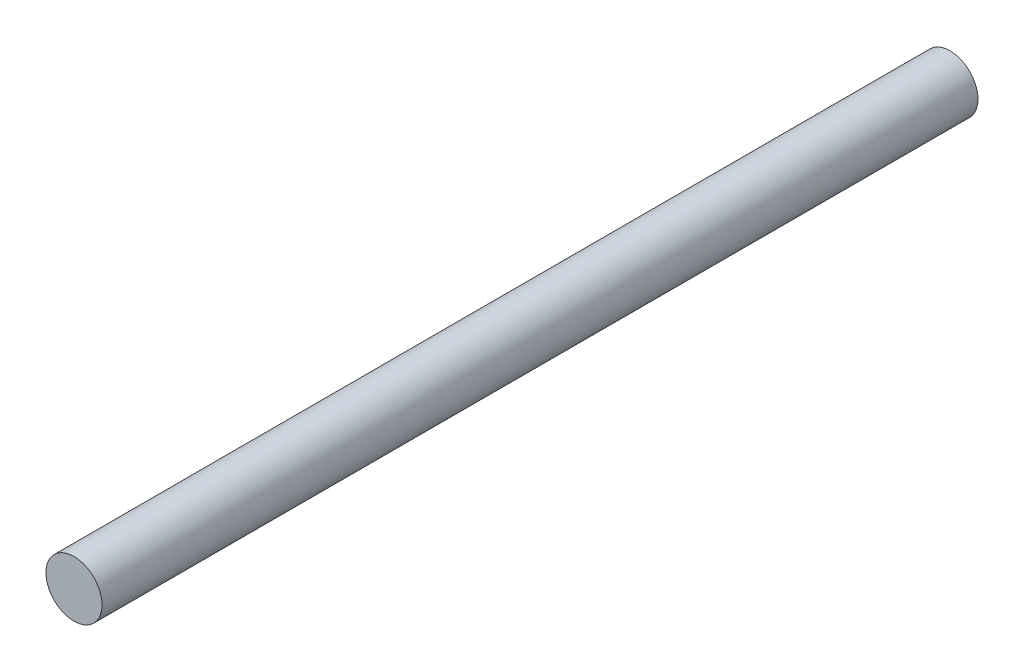
ISO-10303-21;
HEADER;
FILE_DESCRIPTION(('STEP AP214'),'2;1');
FILE_NAME('part.step','',(''),(''),'','','');
FILE_SCHEMA(('AUTOMOTIVE_DESIGN { 1 0 10303 214 1 1 1 1 }'));
ENDSEC;
DATA;
#1=APPLICATION_CONTEXT('core data for automotive mechanical design processes');
#2=APPLICATION_PROTOCOL_DEFINITION('international standard','automotive_design',2000,#1);
#3=PRODUCT_CONTEXT('',#1,'mechanical');
#4=PRODUCT('Part','Part','',(#3));
#5=PRODUCT_RELATED_PRODUCT_CATEGORY('part','',(#4));
#6=PRODUCT_DEFINITION_FORMATION('','',#4);
#7=PRODUCT_DEFINITION_CONTEXT('part definition',#1,'design');
#8=PRODUCT_DEFINITION('design','',#6,#7);
#9=PRODUCT_DEFINITION_SHAPE('','',#8);
#10=(LENGTH_UNIT() NAMED_UNIT(*) SI_UNIT(.MILLI.,.METRE.));
#11=(NAMED_UNIT(*) PLANE_ANGLE_UNIT() SI_UNIT($,.RADIAN.));
#12=(NAMED_UNIT(*) SI_UNIT($,.STERADIAN.) SOLID_ANGLE_UNIT());
#13=UNCERTAINTY_MEASURE_WITH_UNIT(LENGTH_MEASURE(1.E-05),#10,'distance_accuracy_value','');
#14=(GEOMETRIC_REPRESENTATION_CONTEXT(3) GLOBAL_UNCERTAINTY_ASSIGNED_CONTEXT((#13)) GLOBAL_UNIT_ASSIGNED_CONTEXT((#10,
#11,#12)) REPRESENTATION_CONTEXT('',''));
#15=CARTESIAN_POINT('',(0.,0.,0.));
#16=DIRECTION('',(0.,0.,1.));
#17=DIRECTION('',(1.,0.,0.));
#18=AXIS2_PLACEMENT_3D('',#15,#16,#17);
#19=CARTESIAN_POINT('',(0.,0.,500.));
#20=DIRECTION('',(0.,0.,-1.));
#21=DIRECTION('',(-1.,0.,0.));
#22=AXIS2_PLACEMENT_3D('',#19,#20,#21);
#23=CYLINDRICAL_SURFACE('',#22,16.);
#24=CARTESIAN_POINT('',(0.,0.,500.));
#25=DIRECTION('',(0.,0.,1.));
#26=DIRECTION('',(1.,0.,0.));
#27=AXIS2_PLACEMENT_3D('',#24,#25,#26);
#28=CIRCLE('',#27,16.);
#29=CARTESIAN_POINT('',(16.,0.,500.));
#30=VERTEX_POINT('',#29);
#31=EDGE_CURVE('E10',#30,#30,#28,.T.);
#32=ORIENTED_EDGE('',*,*,#31,.F.);
#33=EDGE_LOOP('',(#32));
#34=FACE_BOUND('',#33,.T.);
#35=CARTESIAN_POINT('',(0.,0.,0.));
#36=DIRECTION('',(0.,0.,1.));
#37=DIRECTION('',(1.,0.,0.));
#38=AXIS2_PLACEMENT_3D('',#35,#36,#37);
#39=CIRCLE('',#38,16.);
#40=CARTESIAN_POINT('',(16.,0.,0.));
#41=VERTEX_POINT('',#40);
#42=EDGE_CURVE('E40',#41,#41,#39,.T.);
#43=ORIENTED_EDGE('',*,*,#42,.T.);
#44=EDGE_LOOP('',(#43));
#45=FACE_BOUND('',#44,.T.);
#46=ADVANCED_FACE('F37',(#34,#45),#23,.T.);
#47=CARTESIAN_POINT('',(0.,0.,500.));
#48=DIRECTION('',(0.,0.,1.));
#49=DIRECTION('',(1.,0.,0.));
#50=AXIS2_PLACEMENT_3D('',#47,#48,#49);
#51=PLANE('',#50);
#52=ORIENTED_EDGE('',*,*,#31,.T.);
#53=EDGE_LOOP('',(#52));
#54=FACE_BOUND('',#53,.T.);
#55=ADVANCED_FACE('F54',(#54),#51,.T.);
#56=CARTESIAN_POINT('',(0.,0.,0.));
#57=DIRECTION('',(0.,0.,1.));
#58=DIRECTION('',(1.,0.,0.));
#59=AXIS2_PLACEMENT_3D('',#56,#57,#58);
#60=PLANE('',#59);
#61=ORIENTED_EDGE('',*,*,#42,.F.);
#62=EDGE_LOOP('',(#61));
#63=FACE_BOUND('',#62,.T.);
#64=ADVANCED_FACE('F52',(#63),#60,.F.);
#65=CLOSED_SHELL('',(#46,#55,#64));
#66=MANIFOLD_SOLID_BREP('B2',#65);
#67=ADVANCED_BREP_SHAPE_REPRESENTATION('',(#18,#66),#14);
#68=SHAPE_DEFINITION_REPRESENTATION(#9,#67);
ENDSEC;
END-ISO-10303-21;
